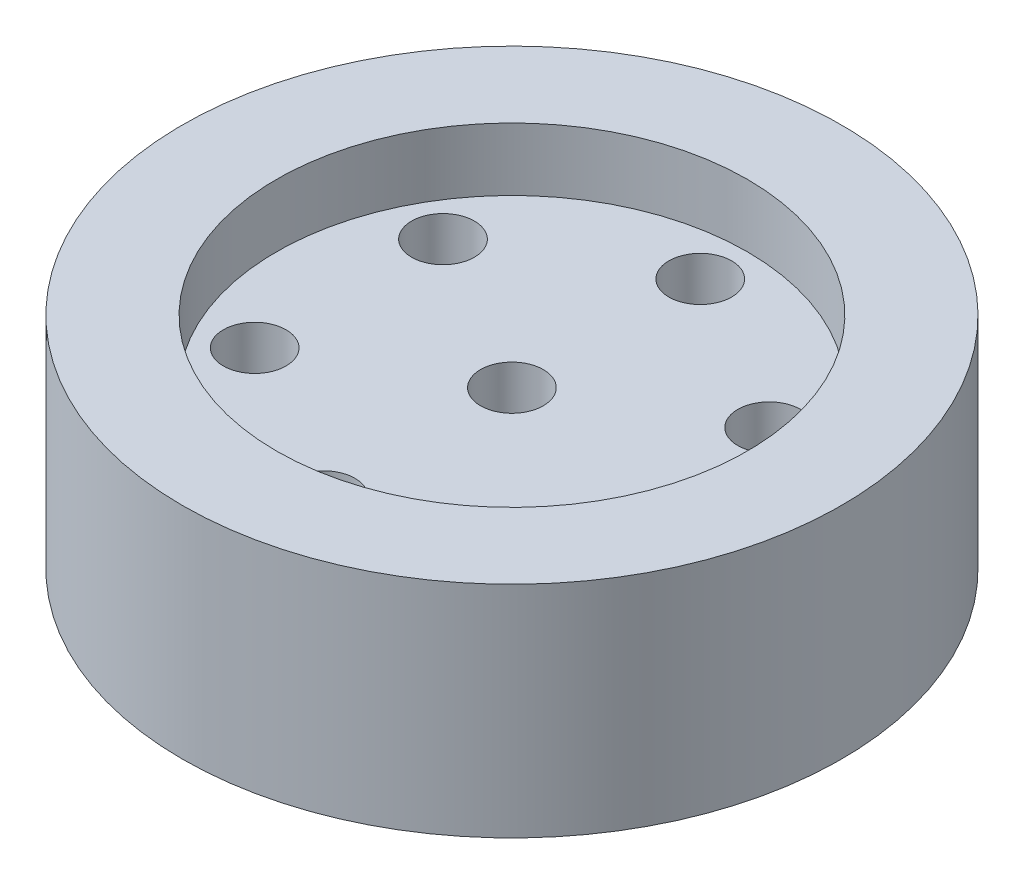
ISO-10303-21;
HEADER;
FILE_DESCRIPTION(('STEP AP214'),'2;1');
FILE_NAME('part.step','',(''),(''),'','','');
FILE_SCHEMA(('AUTOMOTIVE_DESIGN { 1 0 10303 214 1 1 1 1 }'));
ENDSEC;
DATA;
#1=APPLICATION_CONTEXT('core data for automotive mechanical design processes');
#2=APPLICATION_PROTOCOL_DEFINITION('international standard','automotive_design',2000,#1);
#3=PRODUCT_CONTEXT('',#1,'mechanical');
#4=PRODUCT('Part','Part','',(#3));
#5=PRODUCT_RELATED_PRODUCT_CATEGORY('part','',(#4));
#6=PRODUCT_DEFINITION_FORMATION('','',#4);
#7=PRODUCT_DEFINITION_CONTEXT('part definition',#1,'design');
#8=PRODUCT_DEFINITION('design','',#6,#7);
#9=PRODUCT_DEFINITION_SHAPE('','',#8);
#10=(LENGTH_UNIT() NAMED_UNIT(*) SI_UNIT(.MILLI.,.METRE.));
#11=(NAMED_UNIT(*) PLANE_ANGLE_UNIT() SI_UNIT($,.RADIAN.));
#12=(NAMED_UNIT(*) SI_UNIT($,.STERADIAN.) SOLID_ANGLE_UNIT());
#13=UNCERTAINTY_MEASURE_WITH_UNIT(LENGTH_MEASURE(1.E-05),#10,'distance_accuracy_value','');
#14=(GEOMETRIC_REPRESENTATION_CONTEXT(3) GLOBAL_UNCERTAINTY_ASSIGNED_CONTEXT((#13)) GLOBAL_UNIT_ASSIGNED_CONTEXT((#10,
#11,#12)) REPRESENTATION_CONTEXT('',''));
#15=CARTESIAN_POINT('',(0.,0.,0.));
#16=DIRECTION('',(0.,0.,1.));
#17=DIRECTION('',(1.,0.,0.));
#18=AXIS2_PLACEMENT_3D('',#15,#16,#17);
#19=CARTESIAN_POINT('',(0.,14.,0.));
#20=DIRECTION('',(0.,-1.,0.));
#21=DIRECTION('',(0.,0.,-1.));
#22=AXIS2_PLACEMENT_3D('',#19,#20,#21);
#23=CYLINDRICAL_SURFACE('',#22,21.);
#24=CARTESIAN_POINT('',(0.,14.,0.));
#25=DIRECTION('',(0.,1.,0.));
#26=DIRECTION('',(0.,0.,1.));
#27=AXIS2_PLACEMENT_3D('',#24,#25,#26);
#28=CIRCLE('',#27,21.);
#29=CARTESIAN_POINT('',(0.,14.,21.));
#30=VERTEX_POINT('',#29);
#31=EDGE_CURVE('E10',#30,#30,#28,.T.);
#32=ORIENTED_EDGE('',*,*,#31,.F.);
#33=EDGE_LOOP('',(#32));
#34=FACE_BOUND('',#33,.T.);
#35=CARTESIAN_POINT('',(0.,0.,0.));
#36=DIRECTION('',(0.,1.,0.));
#37=DIRECTION('',(0.,0.,1.));
#38=AXIS2_PLACEMENT_3D('',#35,#36,#37);
#39=CIRCLE('',#38,21.);
#40=CARTESIAN_POINT('',(0.,0.,21.));
#41=VERTEX_POINT('',#40);
#42=EDGE_CURVE('E44',#41,#41,#39,.T.);
#43=ORIENTED_EDGE('',*,*,#42,.T.);
#44=EDGE_LOOP('',(#43));
#45=FACE_BOUND('',#44,.T.);
#46=ADVANCED_FACE('F41',(#34,#45),#23,.T.);
#47=CARTESIAN_POINT('',(0.,14.,0.));
#48=DIRECTION('',(0.,1.,0.));
#49=DIRECTION('',(0.,0.,1.));
#50=AXIS2_PLACEMENT_3D('',#47,#48,#49);
#51=PLANE('',#50);
#52=CARTESIAN_POINT('',(0.,14.,0.));
#53=DIRECTION('',(0.,1.,0.));
#54=DIRECTION('',(0.,0.,1.));
#55=AXIS2_PLACEMENT_3D('',#52,#53,#54);
#56=CIRCLE('',#55,15.);
#57=CARTESIAN_POINT('',(0.,14.,15.));
#58=VERTEX_POINT('',#57);
#59=EDGE_CURVE('E53',#58,#58,#56,.T.);
#60=ORIENTED_EDGE('',*,*,#59,.F.);
#61=EDGE_LOOP('',(#60));
#62=FACE_BOUND('',#61,.T.);
#63=ORIENTED_EDGE('',*,*,#31,.T.);
#64=EDGE_LOOP('',(#63));
#65=FACE_BOUND('',#64,.T.);
#66=ADVANCED_FACE('F145',(#62,#65),#51,.T.);
#67=CARTESIAN_POINT('',(0.,0.,0.));
#68=DIRECTION('',(0.,1.,0.));
#69=DIRECTION('',(0.,0.,1.));
#70=AXIS2_PLACEMENT_3D('',#67,#68,#69);
#71=PLANE('',#70);
#72=CARTESIAN_POINT('',(0.,0.,0.));
#73=DIRECTION('',(0.,-1.,0.));
#74=DIRECTION('',(0.,0.,-1.));
#75=AXIS2_PLACEMENT_3D('',#72,#73,#74);
#76=CIRCLE('',#75,19.);
#77=CARTESIAN_POINT('',(0.,0.,-19.));
#78=VERTEX_POINT('',#77);
#79=EDGE_CURVE('E59',#78,#78,#76,.T.);
#80=ORIENTED_EDGE('',*,*,#79,.F.);
#81=EDGE_LOOP('',(#80));
#82=FACE_BOUND('',#81,.T.);
#83=ORIENTED_EDGE('',*,*,#42,.F.);
#84=EDGE_LOOP('',(#83));
#85=FACE_BOUND('',#84,.T.);
#86=ADVANCED_FACE('F141',(#82,#85),#71,.F.);
#87=CARTESIAN_POINT('',(0.,10.,0.));
#88=DIRECTION('',(0.,1.,0.));
#89=DIRECTION('',(0.,0.,1.));
#90=AXIS2_PLACEMENT_3D('',#87,#88,#89);
#91=CYLINDRICAL_SURFACE('',#90,15.);
#92=CARTESIAN_POINT('',(0.,10.,0.));
#93=DIRECTION('',(0.,1.,0.));
#94=DIRECTION('',(0.,0.,1.));
#95=AXIS2_PLACEMENT_3D('',#92,#93,#94);
#96=CIRCLE('',#95,15.);
#97=CARTESIAN_POINT('',(0.,10.,15.));
#98=VERTEX_POINT('',#97);
#99=EDGE_CURVE('E51',#98,#98,#96,.T.);
#100=ORIENTED_EDGE('',*,*,#99,.F.);
#101=EDGE_LOOP('',(#100));
#102=FACE_BOUND('',#101,.T.);
#103=ORIENTED_EDGE('',*,*,#59,.T.);
#104=EDGE_LOOP('',(#103));
#105=FACE_BOUND('',#104,.T.);
#106=ADVANCED_FACE('F144',(#102,#105),#91,.F.);
#107=CARTESIAN_POINT('',(0.,10.,0.));
#108=DIRECTION('',(0.,1.,0.));
#109=DIRECTION('',(0.,0.,1.));
#110=AXIS2_PLACEMENT_3D('',#107,#108,#109);
#111=PLANE('',#110);
#112=CARTESIAN_POINT('',(0.,10.,12.));
#113=DIRECTION('',(0.,1.,0.));
#114=DIRECTION('',(0.,0.,1.));
#115=AXIS2_PLACEMENT_3D('',#112,#113,#114);
#116=CIRCLE('',#115,2.);
#117=CARTESIAN_POINT('',(0.,10.,14.));
#118=VERTEX_POINT('',#117);
#119=EDGE_CURVE('E76',#118,#118,#116,.T.);
#120=ORIENTED_EDGE('',*,*,#119,.F.);
#121=EDGE_LOOP('',(#120));
#122=FACE_BOUND('',#121,.T.);
#123=CARTESIAN_POINT('',(-10.3923048454131,10.,5.9999999999997));
#124=DIRECTION('',(0.,1.,0.));
#125=DIRECTION('',(0.,0.,1.));
#126=AXIS2_PLACEMENT_3D('',#123,#124,#125);
#127=CIRCLE('',#126,2.00000000000039);
#128=CARTESIAN_POINT('',(-10.3923048454131,10.,8.00000000000009));
#129=VERTEX_POINT('',#128);
#130=EDGE_CURVE('E79',#129,#129,#127,.T.);
#131=ORIENTED_EDGE('',*,*,#130,.F.);
#132=EDGE_LOOP('',(#131));
#133=FACE_BOUND('',#132,.T.);
#134=CARTESIAN_POINT('',(-10.3923048454128,10.,-6.0000000000003));
#135=DIRECTION('',(0.,1.,0.));
#136=DIRECTION('',(0.,0.,1.));
#137=AXIS2_PLACEMENT_3D('',#134,#135,#136);
#138=CIRCLE('',#137,2.00000000000068);
#139=CARTESIAN_POINT('',(-10.3923048454128,10.,-3.99999999999962));
#140=VERTEX_POINT('',#139);
#141=EDGE_CURVE('E82',#140,#140,#138,.T.);
#142=ORIENTED_EDGE('',*,*,#141,.F.);
#143=EDGE_LOOP('',(#142));
#144=FACE_BOUND('',#143,.T.);
#145=CARTESIAN_POINT('',(6.77712297852766E-13,10.,-12.));
#146=DIRECTION('',(0.,1.,0.));
#147=DIRECTION('',(0.,0.,1.));
#148=AXIS2_PLACEMENT_3D('',#145,#146,#147);
#149=CIRCLE('',#148,2.00000000000073);
#150=CARTESIAN_POINT('',(6.77712297852766E-13,10.,-9.99999999999927));
#151=VERTEX_POINT('',#150);
#152=EDGE_CURVE('E85',#151,#151,#149,.T.);
#153=ORIENTED_EDGE('',*,*,#152,.F.);
#154=EDGE_LOOP('',(#153));
#155=FACE_BOUND('',#154,.T.);
#156=CARTESIAN_POINT('',(10.3923048454138,10.,-5.99999999999971));
#157=DIRECTION('',(0.,1.,0.));
#158=DIRECTION('',(0.,0.,1.));
#159=AXIS2_PLACEMENT_3D('',#156,#157,#158);
#160=CIRCLE('',#159,2.00000000000045);
#161=CARTESIAN_POINT('',(10.3923048454138,10.,-3.99999999999925));
#162=VERTEX_POINT('',#161);
#163=EDGE_CURVE('E88',#162,#162,#160,.T.);
#164=ORIENTED_EDGE('',*,*,#163,.F.);
#165=EDGE_LOOP('',(#164));
#166=FACE_BOUND('',#165,.T.);
#167=CARTESIAN_POINT('',(10.3923048454134,10.,6.0000000000003));
#168=DIRECTION('',(0.,1.,0.));
#169=DIRECTION('',(0.,0.,1.));
#170=AXIS2_PLACEMENT_3D('',#167,#168,#169);
#171=CIRCLE('',#170,2.00000000000011);
#172=CARTESIAN_POINT('',(10.3923048454134,10.,8.00000000000041));
#173=VERTEX_POINT('',#172);
#174=EDGE_CURVE('E91',#173,#173,#171,.T.);
#175=ORIENTED_EDGE('',*,*,#174,.F.);
#176=EDGE_LOOP('',(#175));
#177=FACE_BOUND('',#176,.T.);
#178=CARTESIAN_POINT('',(0.,10.,0.));
#179=DIRECTION('',(0.,1.,0.));
#180=DIRECTION('',(0.,0.,1.));
#181=AXIS2_PLACEMENT_3D('',#178,#179,#180);
#182=CIRCLE('',#181,2.);
#183=CARTESIAN_POINT('',(0.,10.,2.));
#184=VERTEX_POINT('',#183);
#185=EDGE_CURVE('E68',#184,#184,#182,.T.);
#186=ORIENTED_EDGE('',*,*,#185,.F.);
#187=EDGE_LOOP('',(#186));
#188=FACE_BOUND('',#187,.T.);
#189=ORIENTED_EDGE('',*,*,#99,.T.);
#190=EDGE_LOOP('',(#189));
#191=FACE_BOUND('',#190,.T.);
#192=ADVANCED_FACE('F137',(#122,#133,#144,#155,#166,#177,#188,#191),#111,.T.);
#193=CARTESIAN_POINT('',(0.,4.,0.));
#194=DIRECTION('',(0.,-1.,0.));
#195=DIRECTION('',(0.,0.,-1.));
#196=AXIS2_PLACEMENT_3D('',#193,#194,#195);
#197=CYLINDRICAL_SURFACE('',#196,19.);
#198=CARTESIAN_POINT('',(0.,4.,0.));
#199=DIRECTION('',(0.,-1.,0.));
#200=DIRECTION('',(0.,0.,-1.));
#201=AXIS2_PLACEMENT_3D('',#198,#199,#200);
#202=CIRCLE('',#201,19.);
#203=CARTESIAN_POINT('',(0.,4.,-19.));
#204=VERTEX_POINT('',#203);
#205=EDGE_CURVE('E56',#204,#204,#202,.T.);
#206=ORIENTED_EDGE('',*,*,#205,.F.);
#207=EDGE_LOOP('',(#206));
#208=FACE_BOUND('',#207,.T.);
#209=ORIENTED_EDGE('',*,*,#79,.T.);
#210=EDGE_LOOP('',(#209));
#211=FACE_BOUND('',#210,.T.);
#212=ADVANCED_FACE('F119',(#208,#211),#197,.F.);
#213=CARTESIAN_POINT('',(0.,4.,0.));
#214=DIRECTION('',(0.,-1.,0.));
#215=DIRECTION('',(0.,0.,-1.));
#216=AXIS2_PLACEMENT_3D('',#213,#214,#215);
#217=PLANE('',#216);
#218=CARTESIAN_POINT('',(0.,4.,12.));
#219=DIRECTION('',(0.,-1.,0.));
#220=DIRECTION('',(0.,0.,-1.));
#221=AXIS2_PLACEMENT_3D('',#218,#219,#220);
#222=CIRCLE('',#221,2.);
#223=CARTESIAN_POINT('',(0.,4.,10.));
#224=VERTEX_POINT('',#223);
#225=EDGE_CURVE('E94',#224,#224,#222,.T.);
#226=ORIENTED_EDGE('',*,*,#225,.F.);
#227=EDGE_LOOP('',(#226));
#228=FACE_BOUND('',#227,.T.);
#229=CARTESIAN_POINT('',(-10.3923048454131,4.,5.9999999999997));
#230=DIRECTION('',(0.,-1.,0.));
#231=DIRECTION('',(0.,0.,-1.));
#232=AXIS2_PLACEMENT_3D('',#229,#230,#231);
#233=CIRCLE('',#232,2.00000000000039);
#234=CARTESIAN_POINT('',(-10.3923048454131,4.,3.99999999999931));
#235=VERTEX_POINT('',#234);
#236=EDGE_CURVE('E99',#235,#235,#233,.T.);
#237=ORIENTED_EDGE('',*,*,#236,.F.);
#238=EDGE_LOOP('',(#237));
#239=FACE_BOUND('',#238,.T.);
#240=CARTESIAN_POINT('',(-10.3923048454128,4.,-6.0000000000003));
#241=DIRECTION('',(0.,-1.,0.));
#242=DIRECTION('',(0.,0.,-1.));
#243=AXIS2_PLACEMENT_3D('',#240,#241,#242);
#244=CIRCLE('',#243,2.00000000000068);
#245=CARTESIAN_POINT('',(-10.3923048454128,4.,-8.00000000000098));
#246=VERTEX_POINT('',#245);
#247=EDGE_CURVE('E95',#246,#246,#244,.T.);
#248=ORIENTED_EDGE('',*,*,#247,.F.);
#249=EDGE_LOOP('',(#248));
#250=FACE_BOUND('',#249,.T.);
#251=CARTESIAN_POINT('',(6.77712297852766E-13,4.,-12.));
#252=DIRECTION('',(0.,-1.,0.));
#253=DIRECTION('',(0.,0.,-1.));
#254=AXIS2_PLACEMENT_3D('',#251,#252,#253);
#255=CIRCLE('',#254,2.00000000000073);
#256=CARTESIAN_POINT('',(6.77712297852766E-13,4.,-14.0000000000007));
#257=VERTEX_POINT('',#256);
#258=EDGE_CURVE('E98',#257,#257,#255,.T.);
#259=ORIENTED_EDGE('',*,*,#258,.F.);
#260=EDGE_LOOP('',(#259));
#261=FACE_BOUND('',#260,.T.);
#262=CARTESIAN_POINT('',(10.3923048454138,4.,-5.99999999999971));
#263=DIRECTION('',(0.,-1.,0.));
#264=DIRECTION('',(0.,0.,-1.));
#265=AXIS2_PLACEMENT_3D('',#262,#263,#264);
#266=CIRCLE('',#265,2.00000000000045);
#267=CARTESIAN_POINT('',(10.3923048454138,4.,-8.00000000000016));
#268=VERTEX_POINT('',#267);
#269=EDGE_CURVE('E102',#268,#268,#266,.T.);
#270=ORIENTED_EDGE('',*,*,#269,.F.);
#271=EDGE_LOOP('',(#270));
#272=FACE_BOUND('',#271,.T.);
#273=CARTESIAN_POINT('',(10.3923048454134,4.,6.0000000000003));
#274=DIRECTION('',(0.,-1.,0.));
#275=DIRECTION('',(0.,0.,-1.));
#276=AXIS2_PLACEMENT_3D('',#273,#274,#275);
#277=CIRCLE('',#276,2.00000000000011);
#278=CARTESIAN_POINT('',(10.3923048454134,4.,4.00000000000019));
#279=VERTEX_POINT('',#278);
#280=EDGE_CURVE('E105',#279,#279,#277,.T.);
#281=ORIENTED_EDGE('',*,*,#280,.F.);
#282=EDGE_LOOP('',(#281));
#283=FACE_BOUND('',#282,.T.);
#284=CARTESIAN_POINT('',(0.,4.,0.));
#285=DIRECTION('',(0.,-1.,0.));
#286=DIRECTION('',(0.,0.,-1.));
#287=AXIS2_PLACEMENT_3D('',#284,#285,#286);
#288=CIRCLE('',#287,5.);
#289=CARTESIAN_POINT('',(0.,4.,-5.));
#290=VERTEX_POINT('',#289);
#291=EDGE_CURVE('E62',#290,#290,#288,.T.);
#292=ORIENTED_EDGE('',*,*,#291,.F.);
#293=EDGE_LOOP('',(#292));
#294=FACE_BOUND('',#293,.T.);
#295=ORIENTED_EDGE('',*,*,#205,.T.);
#296=EDGE_LOOP('',(#295));
#297=FACE_BOUND('',#296,.T.);
#298=ADVANCED_FACE('F115',(#228,#239,#250,#261,#272,#283,#294,#297),#217,.T.);
#299=CARTESIAN_POINT('',(0.,4.,0.));
#300=DIRECTION('',(0.,-1.,0.));
#301=DIRECTION('',(0.,0.,-1.));
#302=AXIS2_PLACEMENT_3D('',#299,#300,#301);
#303=CYLINDRICAL_SURFACE('',#302,5.);
#304=ORIENTED_EDGE('',*,*,#291,.T.);
#305=EDGE_LOOP('',(#304));
#306=FACE_BOUND('',#305,.T.);
#307=CARTESIAN_POINT('',(0.,0.,0.));
#308=DIRECTION('',(0.,-1.,0.));
#309=DIRECTION('',(0.,0.,-1.));
#310=AXIS2_PLACEMENT_3D('',#307,#308,#309);
#311=CIRCLE('',#310,5.);
#312=CARTESIAN_POINT('',(0.,0.,-5.));
#313=VERTEX_POINT('',#312);
#314=EDGE_CURVE('E65',#313,#313,#311,.T.);
#315=ORIENTED_EDGE('',*,*,#314,.F.);
#316=EDGE_LOOP('',(#315));
#317=FACE_BOUND('',#316,.T.);
#318=ADVANCED_FACE('F118',(#306,#317),#303,.T.);
#319=CARTESIAN_POINT('',(0.,0.,0.));
#320=DIRECTION('',(0.,-1.,0.));
#321=DIRECTION('',(0.,0.,-1.));
#322=AXIS2_PLACEMENT_3D('',#319,#320,#321);
#323=CIRCLE('',#322,2.);
#324=CARTESIAN_POINT('',(0.,0.,-2.));
#325=VERTEX_POINT('',#324);
#326=EDGE_CURVE('E73',#325,#325,#323,.T.);
#327=ORIENTED_EDGE('',*,*,#326,.F.);
#328=EDGE_LOOP('',(#327));
#329=FACE_BOUND('',#328,.T.);
#330=ORIENTED_EDGE('',*,*,#314,.T.);
#331=EDGE_LOOP('',(#330));
#332=FACE_BOUND('',#331,.T.);
#333=ADVANCED_FACE('F146',(#329,#332),#71,.F.);
#334=CARTESIAN_POINT('',(0.,14.,0.));
#335=DIRECTION('',(0.,-1.,0.));
#336=DIRECTION('',(0.,0.,-1.));
#337=AXIS2_PLACEMENT_3D('',#334,#335,#336);
#338=CYLINDRICAL_SURFACE('',#337,2.);
#339=ORIENTED_EDGE('',*,*,#185,.T.);
#340=EDGE_LOOP('',(#339));
#341=FACE_BOUND('',#340,.T.);
#342=ORIENTED_EDGE('',*,*,#326,.T.);
#343=EDGE_LOOP('',(#342));
#344=FACE_BOUND('',#343,.T.);
#345=ADVANCED_FACE('F169',(#341,#344),#338,.F.);
#346=CARTESIAN_POINT('',(10.3923048454134,14.,6.0000000000003));
#347=DIRECTION('',(0.,-1.,0.));
#348=DIRECTION('',(0.,0.,-1.));
#349=AXIS2_PLACEMENT_3D('',#346,#347,#348);
#350=CYLINDRICAL_SURFACE('',#349,2.00000000000011);
#351=ORIENTED_EDGE('',*,*,#174,.T.);
#352=EDGE_LOOP('',(#351));
#353=FACE_BOUND('',#352,.T.);
#354=ORIENTED_EDGE('',*,*,#280,.T.);
#355=EDGE_LOOP('',(#354));
#356=FACE_BOUND('',#355,.T.);
#357=ADVANCED_FACE('F172',(#353,#356),#350,.F.);
#358=CARTESIAN_POINT('',(10.3923048454138,14.,-5.99999999999971));
#359=DIRECTION('',(0.,-1.,0.));
#360=DIRECTION('',(0.,0.,-1.));
#361=AXIS2_PLACEMENT_3D('',#358,#359,#360);
#362=CYLINDRICAL_SURFACE('',#361,2.00000000000045);
#363=ORIENTED_EDGE('',*,*,#163,.T.);
#364=EDGE_LOOP('',(#363));
#365=FACE_BOUND('',#364,.T.);
#366=ORIENTED_EDGE('',*,*,#269,.T.);
#367=EDGE_LOOP('',(#366));
#368=FACE_BOUND('',#367,.T.);
#369=ADVANCED_FACE('F182',(#365,#368),#362,.F.);
#370=CARTESIAN_POINT('',(6.77712297852766E-13,14.,-12.));
#371=DIRECTION('',(0.,-1.,0.));
#372=DIRECTION('',(0.,0.,-1.));
#373=AXIS2_PLACEMENT_3D('',#370,#371,#372);
#374=CYLINDRICAL_SURFACE('',#373,2.00000000000073);
#375=ORIENTED_EDGE('',*,*,#152,.T.);
#376=EDGE_LOOP('',(#375));
#377=FACE_BOUND('',#376,.T.);
#378=ORIENTED_EDGE('',*,*,#258,.T.);
#379=EDGE_LOOP('',(#378));
#380=FACE_BOUND('',#379,.T.);
#381=ADVANCED_FACE('F178',(#377,#380),#374,.F.);
#382=CARTESIAN_POINT('',(-10.3923048454128,14.,-6.0000000000003));
#383=DIRECTION('',(0.,-1.,0.));
#384=DIRECTION('',(0.,0.,-1.));
#385=AXIS2_PLACEMENT_3D('',#382,#383,#384);
#386=CYLINDRICAL_SURFACE('',#385,2.00000000000068);
#387=ORIENTED_EDGE('',*,*,#141,.T.);
#388=EDGE_LOOP('',(#387));
#389=FACE_BOUND('',#388,.T.);
#390=ORIENTED_EDGE('',*,*,#247,.T.);
#391=EDGE_LOOP('',(#390));
#392=FACE_BOUND('',#391,.T.);
#393=ADVANCED_FACE('F174',(#389,#392),#386,.F.);
#394=CARTESIAN_POINT('',(-10.3923048454131,14.,5.9999999999997));
#395=DIRECTION('',(0.,-1.,0.));
#396=DIRECTION('',(0.,0.,-1.));
#397=AXIS2_PLACEMENT_3D('',#394,#395,#396);
#398=CYLINDRICAL_SURFACE('',#397,2.00000000000039);
#399=ORIENTED_EDGE('',*,*,#130,.T.);
#400=EDGE_LOOP('',(#399));
#401=FACE_BOUND('',#400,.T.);
#402=ORIENTED_EDGE('',*,*,#236,.T.);
#403=EDGE_LOOP('',(#402));
#404=FACE_BOUND('',#403,.T.);
#405=ADVANCED_FACE('F177',(#401,#404),#398,.F.);
#406=CARTESIAN_POINT('',(0.,14.,12.));
#407=DIRECTION('',(0.,-1.,0.));
#408=DIRECTION('',(0.,0.,-1.));
#409=AXIS2_PLACEMENT_3D('',#406,#407,#408);
#410=CYLINDRICAL_SURFACE('',#409,2.);
#411=ORIENTED_EDGE('',*,*,#119,.T.);
#412=EDGE_LOOP('',(#411));
#413=FACE_BOUND('',#412,.T.);
#414=ORIENTED_EDGE('',*,*,#225,.T.);
#415=EDGE_LOOP('',(#414));
#416=FACE_BOUND('',#415,.T.);
#417=ADVANCED_FACE('F113',(#413,#416),#410,.F.);
#418=CLOSED_SHELL('',(#46,#66,#86,#106,#192,#212,#298,#318,#333,#345,#357,#369,#381,#393,#405,#417));
#419=MANIFOLD_SOLID_BREP('B2',#418);
#420=ADVANCED_BREP_SHAPE_REPRESENTATION('',(#18,#419),#14);
#421=SHAPE_DEFINITION_REPRESENTATION(#9,#420);
ENDSEC;
END-ISO-10303-21;
